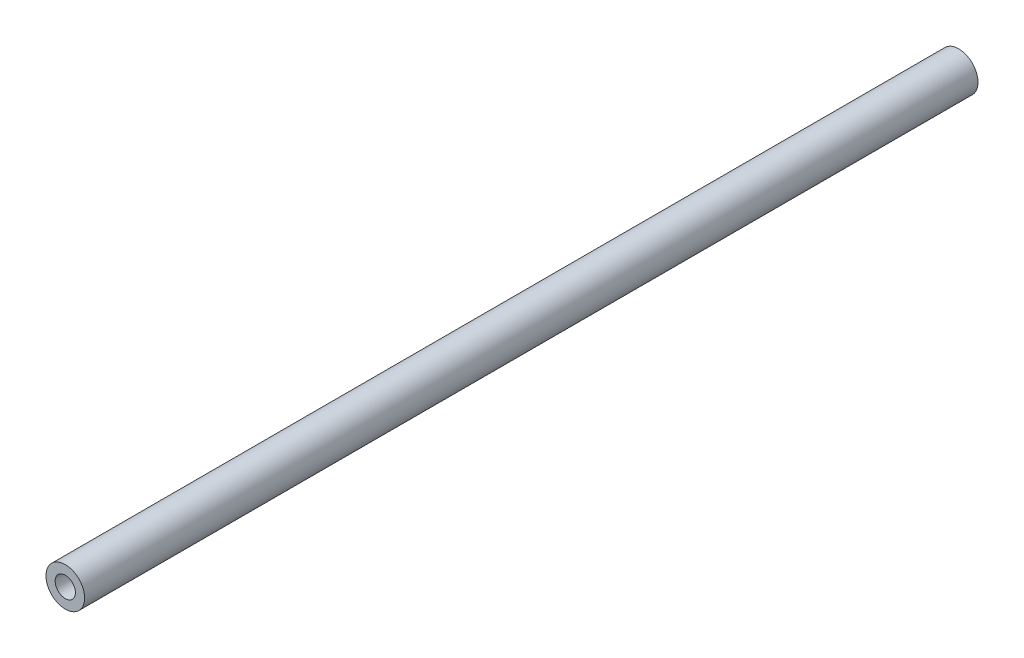
ISO-10303-21;
HEADER;
FILE_DESCRIPTION(('STEP AP214'),'2;1');
FILE_NAME('part.step','',(''),(''),'','','');
FILE_SCHEMA(('AUTOMOTIVE_DESIGN { 1 0 10303 214 1 1 1 1 }'));
ENDSEC;
DATA;
#1=APPLICATION_CONTEXT('core data for automotive mechanical design processes');
#2=APPLICATION_PROTOCOL_DEFINITION('international standard','automotive_design',2000,#1);
#3=PRODUCT_CONTEXT('',#1,'mechanical');
#4=PRODUCT('Part','Part','',(#3));
#5=PRODUCT_RELATED_PRODUCT_CATEGORY('part','',(#4));
#6=PRODUCT_DEFINITION_FORMATION('','',#4);
#7=PRODUCT_DEFINITION_CONTEXT('part definition',#1,'design');
#8=PRODUCT_DEFINITION('design','',#6,#7);
#9=PRODUCT_DEFINITION_SHAPE('','',#8);
#10=(LENGTH_UNIT() NAMED_UNIT(*) SI_UNIT(.MILLI.,.METRE.));
#11=(NAMED_UNIT(*) PLANE_ANGLE_UNIT() SI_UNIT($,.RADIAN.));
#12=(NAMED_UNIT(*) SI_UNIT($,.STERADIAN.) SOLID_ANGLE_UNIT());
#13=UNCERTAINTY_MEASURE_WITH_UNIT(LENGTH_MEASURE(1.E-05),#10,'distance_accuracy_value','');
#14=(GEOMETRIC_REPRESENTATION_CONTEXT(3) GLOBAL_UNCERTAINTY_ASSIGNED_CONTEXT((#13)) GLOBAL_UNIT_ASSIGNED_CONTEXT((#10,
#11,#12)) REPRESENTATION_CONTEXT('',''));
#15=CARTESIAN_POINT('',(0.,0.,0.));
#16=DIRECTION('',(0.,0.,1.));
#17=DIRECTION('',(1.,0.,0.));
#18=AXIS2_PLACEMENT_3D('',#15,#16,#17);
#19=CARTESIAN_POINT('',(66.9178731766462,78.6170238479951,331.907405252862));
#20=DIRECTION('',(-1.1872860521452E-13,0.,-1.));
#21=DIRECTION('',(-1.,0.,1.1872860521452E-13));
#22=AXIS2_PLACEMENT_3D('',#19,#20,#21);
#23=PLANE('',#22);
#24=CARTESIAN_POINT('',(66.9178731766462,78.6170238479951,331.907405252862));
#25=DIRECTION('',(1.1872860521452E-13,0.,1.));
#26=DIRECTION('',(0.400740298191082,0.916191690316892,0.));
#27=AXIS2_PLACEMENT_3D('',#24,#25,#26);
#28=CIRCLE('',#27,2.1);
#29=CARTESIAN_POINT('',(66.0763185504449,76.6930212983296,331.907405252862));
#30=VERTEX_POINT('',#29);
#31=EDGE_CURVE('E88',#30,#30,#28,.T.);
#32=ORIENTED_EDGE('',*,*,#31,.F.);
#33=EDGE_LOOP('',(#32));
#34=FACE_BOUND('',#33,.T.);
#35=CARTESIAN_POINT('',(66.9178731766462,78.6170238479951,331.907405252862));
#36=DIRECTION('',(-1.1872860521452E-13,0.,-1.));
#37=DIRECTION('',(-0.400740298191079,-0.916191690316893,0.));
#38=AXIS2_PLACEMENT_3D('',#35,#36,#37);
#39=CIRCLE('',#38,4.);
#40=CARTESIAN_POINT('',(65.3149119838818,74.9522570867275,331.907405252863));
#41=VERTEX_POINT('',#40);
#42=EDGE_CURVE('E87',#41,#41,#39,.T.);
#43=ORIENTED_EDGE('',*,*,#42,.F.);
#44=EDGE_LOOP('',(#43));
#45=FACE_BOUND('',#44,.T.);
#46=ADVANCED_FACE('F16',(#34,#45),#23,.F.);
#47=CARTESIAN_POINT('',(66.9178731766242,78.6170238479953,146.907405252862));
#48=DIRECTION('',(-1.1872860521452E-13,0.,-1.));
#49=DIRECTION('',(-1.,0.,1.1872860521452E-13));
#50=AXIS2_PLACEMENT_3D('',#47,#48,#49);
#51=PLANE('',#50);
#52=CARTESIAN_POINT('',(66.9178731766242,78.6170238479953,146.907405252862));
#53=DIRECTION('',(-1.1872860521452E-13,0.,-1.));
#54=DIRECTION('',(-0.400740298191082,-0.916191690316892,0.));
#55=AXIS2_PLACEMENT_3D('',#52,#53,#54);
#56=CIRCLE('',#55,2.1);
#57=CARTESIAN_POINT('',(67.7594278028255,80.5410263976607,146.907405252862));
#58=VERTEX_POINT('',#57);
#59=EDGE_CURVE('E65',#58,#58,#56,.T.);
#60=ORIENTED_EDGE('',*,*,#59,.F.);
#61=EDGE_LOOP('',(#60));
#62=FACE_BOUND('',#61,.T.);
#63=CARTESIAN_POINT('',(66.9178731766242,78.6170238479953,146.907405252862));
#64=DIRECTION('',(-1.1872860521452E-13,0.,-1.));
#65=DIRECTION('',(-0.400740298191079,-0.916191690316893,0.));
#66=AXIS2_PLACEMENT_3D('',#63,#64,#65);
#67=CIRCLE('',#66,4.);
#68=CARTESIAN_POINT('',(65.3149119838599,74.9522570867277,146.907405252862));
#69=VERTEX_POINT('',#68);
#70=EDGE_CURVE('E11',#69,#69,#67,.T.);
#71=ORIENTED_EDGE('',*,*,#70,.T.);
#72=EDGE_LOOP('',(#71));
#73=FACE_BOUND('',#72,.T.);
#74=ADVANCED_FACE('F130',(#62,#73),#51,.T.);
#75=CARTESIAN_POINT('',(66.9178731766242,78.6170238479953,146.907405252862));
#76=DIRECTION('',(1.1872860521452E-13,0.,1.));
#77=DIRECTION('',(0.400740298191079,0.916191690316893,0.));
#78=AXIS2_PLACEMENT_3D('',#75,#76,#77);
#79=CYLINDRICAL_SURFACE('',#78,4.);
#80=ORIENTED_EDGE('',*,*,#42,.T.);
#81=DIRECTION('',(-1.1872860521452E-13,0.,-1.));
#82=VECTOR('',#81,1.);
#83=CARTESIAN_POINT('',(65.3149119838599,74.9522570867277,146.907405252862));
#84=LINE('',#83,#82);
#85=EDGE_CURVE('E27',#41,#69,#84,.T.);
#86=ORIENTED_EDGE('',*,*,#85,.T.);
#87=ORIENTED_EDGE('',*,*,#70,.F.);
#88=ORIENTED_EDGE('',*,*,#85,.F.);
#89=EDGE_LOOP('',(#80,#86,#87,#88));
#90=FACE_BOUND('',#89,.T.);
#91=ADVANCED_FACE('F123',(#90),#79,.T.);
#92=CARTESIAN_POINT('',(66.9178731766453,78.6170238479951,324.907405252862));
#93=DIRECTION('',(1.1872860521452E-13,0.,1.));
#94=DIRECTION('',(0.400740298191079,0.916191690316893,0.));
#95=AXIS2_PLACEMENT_3D('',#92,#93,#94);
#96=CONICAL_SURFACE('',#95,2.1,1.02974425867665);
#97=DIRECTION('',(-0.343501479682945,-0.785329558114637,0.515038074910095));
#98=VECTOR('',#97,1.);
#99=CARTESIAN_POINT('',(66.0763185504441,76.6930212983296,324.907405252862));
#100=LINE('',#99,#98);
#101=CARTESIAN_POINT('',(66.9178731766452,78.6170238479951,323.645597952904));
#102=VERTEX_POINT('',#101);
#103=CARTESIAN_POINT('',(66.0763185504441,76.6930212983296,324.907405252862));
#104=VERTEX_POINT('',#103);
#105=EDGE_CURVE('E86',#102,#104,#100,.T.);
#106=ORIENTED_EDGE('',*,*,#105,.T.);
#107=CARTESIAN_POINT('',(66.9178731766453,78.6170238479951,324.907405252862));
#108=DIRECTION('',(1.1872860521452E-13,0.,1.));
#109=DIRECTION('',(0.400740298191079,0.916191690316893,0.));
#110=AXIS2_PLACEMENT_3D('',#107,#108,#109);
#111=CIRCLE('',#110,2.1);
#112=EDGE_CURVE('E75',#104,#104,#111,.T.);
#113=ORIENTED_EDGE('',*,*,#112,.T.);
#114=ORIENTED_EDGE('',*,*,#105,.F.);
#115=EDGE_LOOP('',(#106,#113,#114));
#116=FACE_BOUND('',#115,.T.);
#117=ADVANCED_FACE('F121',(#116),#96,.F.);
#118=CARTESIAN_POINT('',(66.9178731766462,78.6170238479951,331.907405252862));
#119=DIRECTION('',(1.1872860521452E-13,0.,1.));
#120=DIRECTION('',(0.400740298191079,0.916191690316893,0.));
#121=AXIS2_PLACEMENT_3D('',#118,#119,#120);
#122=CYLINDRICAL_SURFACE('',#121,2.1);
#123=ORIENTED_EDGE('',*,*,#112,.F.);
#124=DIRECTION('',(1.1872860521452E-13,0.,1.));
#125=VECTOR('',#124,1.);
#126=CARTESIAN_POINT('',(66.0763185504449,76.6930212983296,331.907405252862));
#127=LINE('',#126,#125);
#128=EDGE_CURVE('E20',#104,#30,#127,.T.);
#129=ORIENTED_EDGE('',*,*,#128,.T.);
#130=ORIENTED_EDGE('',*,*,#31,.T.);
#131=ORIENTED_EDGE('',*,*,#128,.F.);
#132=EDGE_LOOP('',(#123,#129,#130,#131));
#133=FACE_BOUND('',#132,.T.);
#134=ADVANCED_FACE('F119',(#133),#122,.F.);
#135=CARTESIAN_POINT('',(66.917873176625,78.6170238479953,153.907405252862));
#136=DIRECTION('',(-1.1872860521452E-13,0.,-1.));
#137=DIRECTION('',(-0.400740298191079,-0.916191690316893,0.));
#138=AXIS2_PLACEMENT_3D('',#135,#136,#137);
#139=CONICAL_SURFACE('',#138,2.1,1.02974425867666);
#140=DIRECTION('',(0.343501479682946,0.785329558114638,-0.515038074910092));
#141=VECTOR('',#140,1.);
#142=CARTESIAN_POINT('',(67.7594278028263,80.5410263976607,153.907405252862));
#143=LINE('',#142,#141);
#144=CARTESIAN_POINT('',(66.9178731766252,78.6170238479953,155.16921255282));
#145=VERTEX_POINT('',#144);
#146=CARTESIAN_POINT('',(67.7594278028263,80.5410263976607,153.907405252862));
#147=VERTEX_POINT('',#146);
#148=EDGE_CURVE('E71',#145,#147,#143,.T.);
#149=ORIENTED_EDGE('',*,*,#148,.T.);
#150=CARTESIAN_POINT('',(66.917873176625,78.6170238479953,153.907405252862));
#151=DIRECTION('',(-1.1872860521452E-13,0.,-1.));
#152=DIRECTION('',(-0.400740298191079,-0.916191690316893,0.));
#153=AXIS2_PLACEMENT_3D('',#150,#151,#152);
#154=CIRCLE('',#153,2.1);
#155=EDGE_CURVE('E73',#147,#147,#154,.T.);
#156=ORIENTED_EDGE('',*,*,#155,.T.);
#157=ORIENTED_EDGE('',*,*,#148,.F.);
#158=EDGE_LOOP('',(#149,#156,#157));
#159=FACE_BOUND('',#158,.T.);
#160=ADVANCED_FACE('F18',(#159),#139,.F.);
#161=CARTESIAN_POINT('',(66.9178731766242,78.6170238479953,146.907405252862));
#162=DIRECTION('',(-1.1872860521452E-13,0.,-1.));
#163=DIRECTION('',(-0.400740298191079,-0.916191690316893,0.));
#164=AXIS2_PLACEMENT_3D('',#161,#162,#163);
#165=CYLINDRICAL_SURFACE('',#164,2.1);
#166=ORIENTED_EDGE('',*,*,#155,.F.);
#167=DIRECTION('',(-1.1872860521452E-13,0.,-1.));
#168=VECTOR('',#167,1.);
#169=CARTESIAN_POINT('',(67.7594278028255,80.5410263976607,146.907405252862));
#170=LINE('',#169,#168);
#171=EDGE_CURVE('E83',#147,#58,#170,.T.);
#172=ORIENTED_EDGE('',*,*,#171,.T.);
#173=ORIENTED_EDGE('',*,*,#59,.T.);
#174=ORIENTED_EDGE('',*,*,#171,.F.);
#175=EDGE_LOOP('',(#166,#172,#173,#174));
#176=FACE_BOUND('',#175,.T.);
#177=ADVANCED_FACE('F143',(#176),#165,.F.);
#178=CLOSED_SHELL('',(#46,#74,#91,#117,#134,#160,#177));
#179=MANIFOLD_SOLID_BREP('B1',#178);
#180=ADVANCED_BREP_SHAPE_REPRESENTATION('',(#18,#179),#14);
#181=SHAPE_DEFINITION_REPRESENTATION(#9,#180);
ENDSEC;
END-ISO-10303-21;
